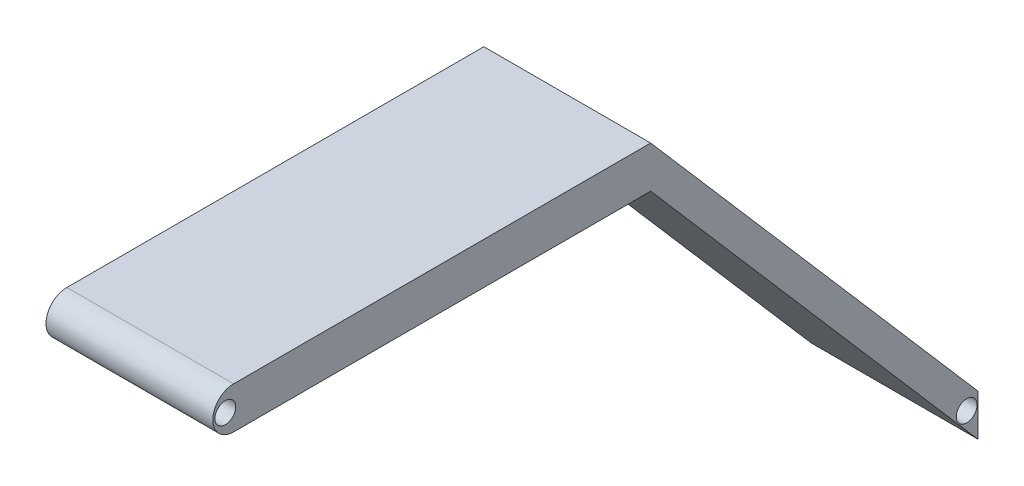
ISO-10303-21;
HEADER;
FILE_DESCRIPTION(('STEP AP214'),'2;1');
FILE_NAME('part.step','',(''),(''),'','','');
FILE_SCHEMA(('AUTOMOTIVE_DESIGN { 1 0 10303 214 1 1 1 1 }'));
ENDSEC;
DATA;
#1=APPLICATION_CONTEXT('core data for automotive mechanical design processes');
#2=APPLICATION_PROTOCOL_DEFINITION('international standard','automotive_design',2000,#1);
#3=PRODUCT_CONTEXT('',#1,'mechanical');
#4=PRODUCT('Part','Part','',(#3));
#5=PRODUCT_RELATED_PRODUCT_CATEGORY('part','',(#4));
#6=PRODUCT_DEFINITION_FORMATION('','',#4);
#7=PRODUCT_DEFINITION_CONTEXT('part definition',#1,'design');
#8=PRODUCT_DEFINITION('design','',#6,#7);
#9=PRODUCT_DEFINITION_SHAPE('','',#8);
#10=(LENGTH_UNIT() NAMED_UNIT(*) SI_UNIT(.MILLI.,.METRE.));
#11=(NAMED_UNIT(*) PLANE_ANGLE_UNIT() SI_UNIT($,.RADIAN.));
#12=(NAMED_UNIT(*) SI_UNIT($,.STERADIAN.) SOLID_ANGLE_UNIT());
#13=UNCERTAINTY_MEASURE_WITH_UNIT(LENGTH_MEASURE(1.E-05),#10,'distance_accuracy_value','');
#14=(GEOMETRIC_REPRESENTATION_CONTEXT(3) GLOBAL_UNCERTAINTY_ASSIGNED_CONTEXT((#13)) GLOBAL_UNIT_ASSIGNED_CONTEXT((#10,
#11,#12)) REPRESENTATION_CONTEXT('',''));
#15=CARTESIAN_POINT('',(0.,0.,0.));
#16=DIRECTION('',(0.,0.,1.));
#17=DIRECTION('',(1.,0.,0.));
#18=AXIS2_PLACEMENT_3D('',#15,#16,#17);
#19=CARTESIAN_POINT('',(6.90909090909091,9.16299768914511,23.870700372836));
#20=DIRECTION('',(0.,-1.,0.));
#21=DIRECTION('',(0.,0.,-1.));
#22=AXIS2_PLACEMENT_3D('',#19,#20,#21);
#23=PLANE('',#22);
#24=DIRECTION('',(0.,0.,1.));
#25=VECTOR('',#24,1.);
#26=CARTESIAN_POINT('',(-2.90909090909091,9.16299768914511,23.870700372836));
#27=LINE('',#26,#25);
#28=CARTESIAN_POINT('',(-2.90909090909091,9.16299768914511,-0.674754172618577));
#29=VERTEX_POINT('',#28);
#30=CARTESIAN_POINT('',(-2.90909090909091,9.16299768914511,23.870700372836));
#31=VERTEX_POINT('',#30);
#32=EDGE_CURVE('E73',#29,#31,#27,.T.);
#33=ORIENTED_EDGE('',*,*,#32,.T.);
#34=DIRECTION('',(-1.,0.,0.));
#35=VECTOR('',#34,1.);
#36=CARTESIAN_POINT('',(6.90909090909091,9.16299768914511,23.870700372836));
#37=LINE('',#36,#35);
#38=CARTESIAN_POINT('',(6.90909090909091,9.16299768914511,23.870700372836));
#39=VERTEX_POINT('',#38);
#40=EDGE_CURVE('E52',#39,#31,#37,.T.);
#41=ORIENTED_EDGE('',*,*,#40,.F.);
#42=DIRECTION('',(0.,0.,1.));
#43=VECTOR('',#42,1.);
#44=CARTESIAN_POINT('',(6.90909090909091,9.16299768914511,23.870700372836));
#45=LINE('',#44,#43);
#46=CARTESIAN_POINT('',(6.90909090909091,9.16299768914511,-0.674754172618577));
#47=VERTEX_POINT('',#46);
#48=EDGE_CURVE('E97',#47,#39,#45,.T.);
#49=ORIENTED_EDGE('',*,*,#48,.F.);
#50=DIRECTION('',(-1.,0.,0.));
#51=VECTOR('',#50,1.);
#52=CARTESIAN_POINT('',(6.90909090909091,9.16299768914511,-0.674754172618577));
#53=LINE('',#52,#51);
#54=EDGE_CURVE('E11',#47,#29,#53,.T.);
#55=ORIENTED_EDGE('',*,*,#54,.T.);
#56=EDGE_LOOP('',(#33,#41,#49,#55));
#57=FACE_BOUND('',#56,.T.);
#58=ADVANCED_FACE('F42',(#57),#23,.F.);
#59=CARTESIAN_POINT('',(6.90909090909091,6.70845223459965,23.870700372836));
#60=DIRECTION('',(0.,1.,0.));
#61=DIRECTION('',(0.,0.,1.));
#62=AXIS2_PLACEMENT_3D('',#59,#60,#61);
#63=PLANE('',#62);
#64=DIRECTION('',(0.,0.,-1.));
#65=VECTOR('',#64,1.);
#66=CARTESIAN_POINT('',(-2.90909090909091,6.70845223459965,23.870700372836));
#67=LINE('',#66,#65);
#68=CARTESIAN_POINT('',(-2.90909090909091,6.70845223459965,23.870700372836));
#69=VERTEX_POINT('',#68);
#70=CARTESIAN_POINT('',(-2.90909090909091,6.70845223459965,-0.674754172618577));
#71=VERTEX_POINT('',#70);
#72=EDGE_CURVE('E107',#69,#71,#67,.T.);
#73=ORIENTED_EDGE('',*,*,#72,.T.);
#74=DIRECTION('',(-1.,0.,0.));
#75=VECTOR('',#74,1.);
#76=CARTESIAN_POINT('',(6.90909090909091,6.70845223459965,-0.674754172618577));
#77=LINE('',#76,#75);
#78=CARTESIAN_POINT('',(6.90909090909091,6.70845223459965,-0.674754172618577));
#79=VERTEX_POINT('',#78);
#80=EDGE_CURVE('E155',#79,#71,#77,.T.);
#81=ORIENTED_EDGE('',*,*,#80,.F.);
#82=DIRECTION('',(0.,0.,-1.));
#83=VECTOR('',#82,1.);
#84=CARTESIAN_POINT('',(6.90909090909091,6.70845223459965,23.870700372836));
#85=LINE('',#84,#83);
#86=CARTESIAN_POINT('',(6.90909090909091,6.70845223459965,23.870700372836));
#87=VERTEX_POINT('',#86);
#88=EDGE_CURVE('E61',#87,#79,#85,.T.);
#89=ORIENTED_EDGE('',*,*,#88,.F.);
#90=DIRECTION('',(-1.,0.,0.));
#91=VECTOR('',#90,1.);
#92=CARTESIAN_POINT('',(6.90909090909091,6.70845223459965,23.870700372836));
#93=LINE('',#92,#91);
#94=EDGE_CURVE('E113',#87,#69,#93,.T.);
#95=ORIENTED_EDGE('',*,*,#94,.T.);
#96=EDGE_LOOP('',(#73,#81,#89,#95));
#97=FACE_BOUND('',#96,.T.);
#98=ADVANCED_FACE('F166',(#97),#63,.F.);
#99=CARTESIAN_POINT('',(6.90909090909091,-4.7650212528297,-3.55698557757725));
#100=DIRECTION('',(1.,0.,0.));
#101=DIRECTION('',(0.,0.,-1.));
#102=AXIS2_PLACEMENT_3D('',#99,#100,#101);
#103=PLANE('',#102);
#104=CARTESIAN_POINT('',(6.90909090909091,-13.7875012132774,-19.2750584142099));
#105=DIRECTION('',(1.,0.,0.));
#106=DIRECTION('',(0.,0.,-1.));
#107=AXIS2_PLACEMENT_3D('',#104,#105,#106);
#108=CIRCLE('',#107,0.613636363636365);
#109=CARTESIAN_POINT('',(6.90909090909091,-13.7875012132774,-19.8886947778462));
#110=VERTEX_POINT('',#109);
#111=EDGE_CURVE('E203',#110,#110,#108,.T.);
#112=ORIENTED_EDGE('',*,*,#111,.F.);
#113=EDGE_LOOP('',(#112));
#114=FACE_BOUND('',#113,.T.);
#115=CARTESIAN_POINT('',(6.90909090909091,7.93572496187238,24.3616094637451));
#116=DIRECTION('',(1.,0.,0.));
#117=DIRECTION('',(0.,0.,-1.));
#118=AXIS2_PLACEMENT_3D('',#115,#116,#117);
#119=CIRCLE('',#118,0.613636363636363);
#120=CARTESIAN_POINT('',(6.90909090909091,7.93572496187238,23.7479731001087));
#121=VERTEX_POINT('',#120);
#122=EDGE_CURVE('E126',#121,#121,#119,.T.);
#123=ORIENTED_EDGE('',*,*,#122,.F.);
#124=EDGE_LOOP('',(#123));
#125=FACE_BOUND('',#124,.T.);
#126=ORIENTED_EDGE('',*,*,#88,.T.);
#127=DIRECTION('',(0.,-0.756401227008137,-0.654107929764336));
#128=VECTOR('',#127,1.);
#129=CARTESIAN_POINT('',(6.90909090909091,6.70845223459965,-0.674754172618577));
#130=LINE('',#129,#128);
#131=CARTESIAN_POINT('',(6.90909090909091,-15.5710020881855,-19.9412059220408));
#132=VERTEX_POINT('',#131);
#133=EDGE_CURVE('E144',#79,#132,#130,.T.);
#134=ORIENTED_EDGE('',*,*,#133,.T.);
#135=DIRECTION('',(0.,1.,0.));
#136=VECTOR('',#135,1.);
#137=CARTESIAN_POINT('',(6.90909090909091,-13.11645663364,-19.9412059220408));
#138=LINE('',#137,#136);
#139=CARTESIAN_POINT('',(6.90909090909091,-13.11645663364,-19.9412059220408));
#140=VERTEX_POINT('',#139);
#141=EDGE_CURVE('E133',#132,#140,#138,.T.);
#142=ORIENTED_EDGE('',*,*,#141,.T.);
#143=DIRECTION('',(0.,0.756401227008137,0.654107929764336));
#144=VECTOR('',#143,1.);
#145=CARTESIAN_POINT('',(6.90909090909091,9.16299768914511,-0.674754172618577));
#146=LINE('',#145,#144);
#147=EDGE_CURVE('E103',#140,#47,#146,.T.);
#148=ORIENTED_EDGE('',*,*,#147,.T.);
#149=ORIENTED_EDGE('',*,*,#48,.T.);
#150=CARTESIAN_POINT('',(6.90909090909091,7.93572496187238,23.870700372836));
#151=DIRECTION('',(1.,0.,0.));
#152=DIRECTION('',(0.,0.,1.));
#153=AXIS2_PLACEMENT_3D('',#150,#151,#152);
#154=CIRCLE('',#153,1.22727272727273);
#155=EDGE_CURVE('E101',#39,#87,#154,.T.);
#156=ORIENTED_EDGE('',*,*,#155,.T.);
#157=EDGE_LOOP('',(#126,#134,#142,#148,#149,#156));
#158=FACE_BOUND('',#157,.T.);
#159=ADVANCED_FACE('F99',(#114,#125,#158),#103,.T.);
#160=CARTESIAN_POINT('',(-2.90909090909091,-4.7650212528297,-3.55698557757725));
#161=DIRECTION('',(1.,0.,0.));
#162=DIRECTION('',(0.,0.,-1.));
#163=AXIS2_PLACEMENT_3D('',#160,#161,#162);
#164=PLANE('',#163);
#165=CARTESIAN_POINT('',(-2.90909090909091,-13.7875012132774,-19.2750584142099));
#166=DIRECTION('',(1.,0.,0.));
#167=DIRECTION('',(0.,0.,-1.));
#168=AXIS2_PLACEMENT_3D('',#165,#166,#167);
#169=CIRCLE('',#168,0.613636363636365);
#170=CARTESIAN_POINT('',(-2.90909090909091,-13.7875012132774,-19.8886947778462));
#171=VERTEX_POINT('',#170);
#172=EDGE_CURVE('E45',#171,#171,#169,.T.);
#173=ORIENTED_EDGE('',*,*,#172,.T.);
#174=EDGE_LOOP('',(#173));
#175=FACE_BOUND('',#174,.T.);
#176=CARTESIAN_POINT('',(-2.90909090909091,7.93572496187238,24.3616094637451));
#177=DIRECTION('',(1.,0.,0.));
#178=DIRECTION('',(0.,0.,-1.));
#179=AXIS2_PLACEMENT_3D('',#176,#177,#178);
#180=CIRCLE('',#179,0.613636363636363);
#181=CARTESIAN_POINT('',(-2.90909090909091,7.93572496187238,23.7479731001087));
#182=VERTEX_POINT('',#181);
#183=EDGE_CURVE('E120',#182,#182,#180,.T.);
#184=ORIENTED_EDGE('',*,*,#183,.T.);
#185=EDGE_LOOP('',(#184));
#186=FACE_BOUND('',#185,.T.);
#187=ORIENTED_EDGE('',*,*,#32,.F.);
#188=DIRECTION('',(0.,0.756401227008137,0.654107929764336));
#189=VECTOR('',#188,1.);
#190=CARTESIAN_POINT('',(-2.90909090909091,9.16299768914511,-0.674754172618577));
#191=LINE('',#190,#189);
#192=CARTESIAN_POINT('',(-2.90909090909091,-13.11645663364,-19.9412059220408));
#193=VERTEX_POINT('',#192);
#194=EDGE_CURVE('E129',#193,#29,#191,.T.);
#195=ORIENTED_EDGE('',*,*,#194,.F.);
#196=DIRECTION('',(0.,1.,0.));
#197=VECTOR('',#196,1.);
#198=CARTESIAN_POINT('',(-2.90909090909091,-13.11645663364,-19.9412059220408));
#199=LINE('',#198,#197);
#200=CARTESIAN_POINT('',(-2.90909090909091,-15.5710020881855,-19.9412059220408));
#201=VERTEX_POINT('',#200);
#202=EDGE_CURVE('E137',#201,#193,#199,.T.);
#203=ORIENTED_EDGE('',*,*,#202,.F.);
#204=DIRECTION('',(0.,-0.756401227008137,-0.654107929764336));
#205=VECTOR('',#204,1.);
#206=CARTESIAN_POINT('',(-2.90909090909091,6.70845223459965,-0.674754172618577));
#207=LINE('',#206,#205);
#208=EDGE_CURVE('E132',#71,#201,#207,.T.);
#209=ORIENTED_EDGE('',*,*,#208,.F.);
#210=ORIENTED_EDGE('',*,*,#72,.F.);
#211=CARTESIAN_POINT('',(-2.90909090909091,7.93572496187238,23.870700372836));
#212=DIRECTION('',(1.,0.,0.));
#213=DIRECTION('',(0.,0.,1.));
#214=AXIS2_PLACEMENT_3D('',#211,#212,#213);
#215=CIRCLE('',#214,1.22727272727273);
#216=EDGE_CURVE('E119',#31,#69,#215,.T.);
#217=ORIENTED_EDGE('',*,*,#216,.F.);
#218=EDGE_LOOP('',(#187,#195,#203,#209,#210,#217));
#219=FACE_BOUND('',#218,.T.);
#220=ADVANCED_FACE('F169',(#175,#186,#219),#164,.F.);
#221=CARTESIAN_POINT('',(-2.90909090909091,9.16299768914511,-0.674754172618577));
#222=DIRECTION('',(0.,0.654107929764336,-0.756401227008137));
#223=DIRECTION('',(0.,0.756401227008137,0.654107929764336));
#224=AXIS2_PLACEMENT_3D('',#221,#222,#223);
#225=PLANE('',#224);
#226=ORIENTED_EDGE('',*,*,#147,.F.);
#227=DIRECTION('',(1.,0.,0.));
#228=VECTOR('',#227,1.);
#229=CARTESIAN_POINT('',(-2.90909090909091,-13.11645663364,-19.9412059220408));
#230=LINE('',#229,#228);
#231=EDGE_CURVE('E82',#193,#140,#230,.T.);
#232=ORIENTED_EDGE('',*,*,#231,.F.);
#233=ORIENTED_EDGE('',*,*,#194,.T.);
#234=ORIENTED_EDGE('',*,*,#54,.F.);
#235=EDGE_LOOP('',(#226,#232,#233,#234));
#236=FACE_BOUND('',#235,.T.);
#237=ADVANCED_FACE('F178',(#236),#225,.T.);
#238=CARTESIAN_POINT('',(-2.90909090909091,-13.11645663364,-19.9412059220408));
#239=DIRECTION('',(0.,0.,-1.));
#240=DIRECTION('',(-1.,0.,0.));
#241=AXIS2_PLACEMENT_3D('',#238,#239,#240);
#242=PLANE('',#241);
#243=ORIENTED_EDGE('',*,*,#141,.F.);
#244=DIRECTION('',(1.,0.,0.));
#245=VECTOR('',#244,1.);
#246=CARTESIAN_POINT('',(-2.90909090909091,-15.5710020881855,-19.9412059220408));
#247=LINE('',#246,#245);
#248=EDGE_CURVE('E141',#201,#132,#247,.T.);
#249=ORIENTED_EDGE('',*,*,#248,.F.);
#250=ORIENTED_EDGE('',*,*,#202,.T.);
#251=ORIENTED_EDGE('',*,*,#231,.T.);
#252=EDGE_LOOP('',(#243,#249,#250,#251));
#253=FACE_BOUND('',#252,.T.);
#254=ADVANCED_FACE('F177',(#253),#242,.T.);
#255=CARTESIAN_POINT('',(-2.90909090909091,6.70845223459965,-0.674754172618577));
#256=DIRECTION('',(0.,-0.654107929764336,0.756401227008137));
#257=DIRECTION('',(0.,-0.756401227008137,-0.654107929764336));
#258=AXIS2_PLACEMENT_3D('',#255,#256,#257);
#259=PLANE('',#258);
#260=ORIENTED_EDGE('',*,*,#133,.F.);
#261=ORIENTED_EDGE('',*,*,#80,.T.);
#262=ORIENTED_EDGE('',*,*,#208,.T.);
#263=ORIENTED_EDGE('',*,*,#248,.T.);
#264=EDGE_LOOP('',(#260,#261,#262,#263));
#265=FACE_BOUND('',#264,.T.);
#266=ADVANCED_FACE('F174',(#265),#259,.T.);
#267=CARTESIAN_POINT('',(-2.90909090909091,7.93572496187238,23.870700372836));
#268=DIRECTION('',(1.,0.,0.));
#269=DIRECTION('',(0.,0.,-1.));
#270=AXIS2_PLACEMENT_3D('',#267,#268,#269);
#271=CYLINDRICAL_SURFACE('',#270,1.22727272727273);
#272=ORIENTED_EDGE('',*,*,#155,.F.);
#273=ORIENTED_EDGE('',*,*,#40,.T.);
#274=ORIENTED_EDGE('',*,*,#216,.T.);
#275=ORIENTED_EDGE('',*,*,#94,.F.);
#276=EDGE_LOOP('',(#272,#273,#274,#275));
#277=FACE_BOUND('',#276,.T.);
#278=ADVANCED_FACE('F116',(#277),#271,.T.);
#279=CARTESIAN_POINT('',(-17.6363636363636,7.93572496187238,24.3616094637451));
#280=DIRECTION('',(1.,0.,0.));
#281=DIRECTION('',(0.,0.,-1.));
#282=AXIS2_PLACEMENT_3D('',#279,#280,#281);
#283=CYLINDRICAL_SURFACE('',#282,0.613636363636363);
#284=ORIENTED_EDGE('',*,*,#122,.T.);
#285=EDGE_LOOP('',(#284));
#286=FACE_BOUND('',#285,.T.);
#287=ORIENTED_EDGE('',*,*,#183,.F.);
#288=EDGE_LOOP('',(#287));
#289=FACE_BOUND('',#288,.T.);
#290=ADVANCED_FACE('F216',(#286,#289),#283,.F.);
#291=CARTESIAN_POINT('',(-17.6363636363636,-13.7875012132774,-19.2750584142099));
#292=DIRECTION('',(1.,0.,0.));
#293=DIRECTION('',(0.,0.,-1.));
#294=AXIS2_PLACEMENT_3D('',#291,#292,#293);
#295=CYLINDRICAL_SURFACE('',#294,0.613636363636365);
#296=ORIENTED_EDGE('',*,*,#111,.T.);
#297=EDGE_LOOP('',(#296));
#298=FACE_BOUND('',#297,.T.);
#299=ORIENTED_EDGE('',*,*,#172,.F.);
#300=EDGE_LOOP('',(#299));
#301=FACE_BOUND('',#300,.T.);
#302=ADVANCED_FACE('F213',(#298,#301),#295,.F.);
#303=CLOSED_SHELL('',(#58,#98,#159,#220,#237,#254,#266,#278,#290,#302));
#304=MANIFOLD_SOLID_BREP('B2',#303);
#305=ADVANCED_BREP_SHAPE_REPRESENTATION('',(#18,#304),#14);
#306=SHAPE_DEFINITION_REPRESENTATION(#9,#305);
ENDSEC;
END-ISO-10303-21;
